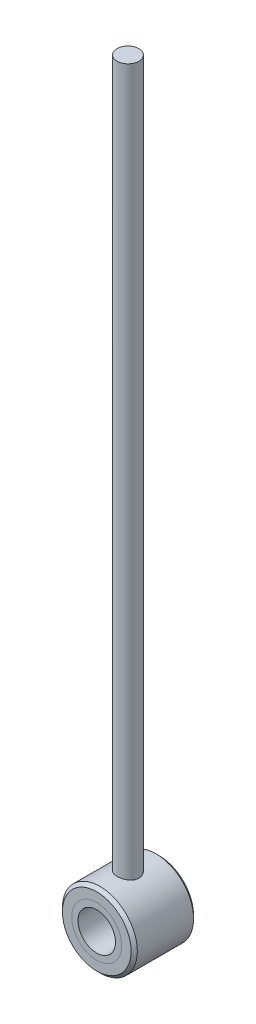
ISO-10303-21;
HEADER;
FILE_DESCRIPTION(('STEP AP214'),'2;1');
FILE_NAME('part.step','',(''),(''),'','','');
FILE_SCHEMA(('AUTOMOTIVE_DESIGN { 1 0 10303 214 1 1 1 1 }'));
ENDSEC;
DATA;
#1=APPLICATION_CONTEXT('core data for automotive mechanical design processes');
#2=APPLICATION_PROTOCOL_DEFINITION('international standard','automotive_design',2000,#1);
#3=PRODUCT_CONTEXT('',#1,'mechanical');
#4=PRODUCT('Part','Part','',(#3));
#5=PRODUCT_RELATED_PRODUCT_CATEGORY('part','',(#4));
#6=PRODUCT_DEFINITION_FORMATION('','',#4);
#7=PRODUCT_DEFINITION_CONTEXT('part definition',#1,'design');
#8=PRODUCT_DEFINITION('design','',#6,#7);
#9=PRODUCT_DEFINITION_SHAPE('','',#8);
#10=(LENGTH_UNIT() NAMED_UNIT(*) SI_UNIT(.MILLI.,.METRE.));
#11=(NAMED_UNIT(*) PLANE_ANGLE_UNIT() SI_UNIT($,.RADIAN.));
#12=(NAMED_UNIT(*) SI_UNIT($,.STERADIAN.) SOLID_ANGLE_UNIT());
#13=UNCERTAINTY_MEASURE_WITH_UNIT(LENGTH_MEASURE(1.E-05),#10,'distance_accuracy_value','');
#14=(GEOMETRIC_REPRESENTATION_CONTEXT(3) GLOBAL_UNCERTAINTY_ASSIGNED_CONTEXT((#13)) GLOBAL_UNIT_ASSIGNED_CONTEXT((#10,
#11,#12)) REPRESENTATION_CONTEXT('',''));
#15=CARTESIAN_POINT('',(0.,0.,0.));
#16=DIRECTION('',(0.,0.,1.));
#17=DIRECTION('',(1.,0.,0.));
#18=AXIS2_PLACEMENT_3D('',#15,#16,#17);
#19=CARTESIAN_POINT('',(0.,-63.,5.));
#20=DIRECTION('',(0.,0.,1.));
#21=DIRECTION('',(1.,0.,0.));
#22=AXIS2_PLACEMENT_3D('',#19,#20,#21);
#23=PLANE('',#22);
#24=CARTESIAN_POINT('',(0.,-63.,5.));
#25=DIRECTION('',(0.,0.,1.));
#26=DIRECTION('',(1.,0.,0.));
#27=AXIS2_PLACEMENT_3D('',#24,#25,#26);
#28=CIRCLE('',#27,5.5);
#29=CARTESIAN_POINT('',(5.5,-63.,5.));
#30=VERTEX_POINT('',#29);
#31=EDGE_CURVE('E85',#30,#30,#28,.T.);
#32=ORIENTED_EDGE('',*,*,#31,.T.);
#33=EDGE_LOOP('',(#32));
#34=FACE_BOUND('',#33,.T.);
#35=CARTESIAN_POINT('',(0.,-63.,5.));
#36=DIRECTION('',(0.,0.,1.));
#37=DIRECTION('',(1.,0.,0.));
#38=AXIS2_PLACEMENT_3D('',#35,#36,#37);
#39=CIRCLE('',#38,4.);
#40=CARTESIAN_POINT('',(4.,-63.,5.));
#41=VERTEX_POINT('',#40);
#42=EDGE_CURVE('E89',#41,#41,#39,.T.);
#43=ORIENTED_EDGE('',*,*,#42,.F.);
#44=EDGE_LOOP('',(#43));
#45=FACE_BOUND('',#44,.T.);
#46=ADVANCED_FACE('F55',(#34,#45),#23,.T.);
#47=CARTESIAN_POINT('',(0.,-63.,-5.));
#48=DIRECTION('',(0.,0.,1.));
#49=DIRECTION('',(1.,0.,0.));
#50=AXIS2_PLACEMENT_3D('',#47,#48,#49);
#51=PLANE('',#50);
#52=CARTESIAN_POINT('',(0.,-63.,-5.));
#53=DIRECTION('',(0.,0.,1.));
#54=DIRECTION('',(1.,0.,0.));
#55=AXIS2_PLACEMENT_3D('',#52,#53,#54);
#56=CIRCLE('',#55,5.5);
#57=CARTESIAN_POINT('',(5.5,-63.,-5.));
#58=VERTEX_POINT('',#57);
#59=EDGE_CURVE('E72',#58,#58,#56,.F.);
#60=ORIENTED_EDGE('',*,*,#59,.T.);
#61=EDGE_LOOP('',(#60));
#62=FACE_BOUND('',#61,.T.);
#63=CARTESIAN_POINT('',(0.,-63.,-5.));
#64=DIRECTION('',(0.,0.,1.));
#65=DIRECTION('',(1.,0.,0.));
#66=AXIS2_PLACEMENT_3D('',#63,#64,#65);
#67=CIRCLE('',#66,4.);
#68=CARTESIAN_POINT('',(4.,-63.,-5.));
#69=VERTEX_POINT('',#68);
#70=EDGE_CURVE('E90',#69,#69,#67,.T.);
#71=ORIENTED_EDGE('',*,*,#70,.T.);
#72=EDGE_LOOP('',(#71));
#73=FACE_BOUND('',#72,.T.);
#74=ADVANCED_FACE('F102',(#62,#73),#51,.F.);
#75=CARTESIAN_POINT('',(0.,-63.,5.));
#76=DIRECTION('',(0.,0.,-1.));
#77=DIRECTION('',(-1.,0.,0.));
#78=AXIS2_PLACEMENT_3D('',#75,#76,#77);
#79=CYLINDRICAL_SURFACE('',#78,6.);
#80=CARTESIAN_POINT('',(0.,-57.,1.75));
#81=CARTESIAN_POINT('',(0.0961253080181352,-57.0000010206722,1.74999851514796));
#82=CARTESIAN_POINT('',(0.192265738977875,-57.0023322744408,1.74205359001831));
#83=CARTESIAN_POINT('',(0.381754666118445,-57.0114047306242,1.71055420393174));
#84=CARTESIAN_POINT('',(0.475102186570465,-57.0181474558412,1.6869943527991));
#85=CARTESIAN_POINT('',(0.656244329270383,-57.0353026213043,1.62511299381745));
#86=CARTESIAN_POINT('',(0.744046672462425,-57.0457098201764,1.58681256248942));
#87=CARTESIAN_POINT('',(0.911982923632397,-57.0691075569196,1.49662155840011));
#88=CARTESIAN_POINT('',(0.992115936834367,-57.0820983956794,1.44472940253345));
#89=CARTESIAN_POINT('',(1.14462561886912,-57.1096697560034,1.32733498418698));
#90=CARTESIAN_POINT('',(1.21676335643119,-57.1242814923017,1.26152966416692));
#91=CARTESIAN_POINT('',(1.34915166645238,-57.1532580108916,1.11882327100677));
#92=CARTESIAN_POINT('',(1.40940036887666,-57.1676227540096,1.0419204556219));
#93=CARTESIAN_POINT('',(1.51753336674037,-57.1948061648788,0.877210332860645));
#94=CARTESIAN_POINT('',(1.56513041604445,-57.2075858824139,0.789207418233691));
#95=CARTESIAN_POINT('',(1.64475391362963,-57.2296876830163,0.606013923598272));
#96=CARTESIAN_POINT('',(1.67678387060038,-57.239010545117,0.510824968855166));
#97=CARTESIAN_POINT('',(1.72351063083406,-57.2528185569123,0.318635370297666));
#98=CARTESIAN_POINT('',(1.73864609017391,-57.2574258647509,0.22175038253513));
#99=CARTESIAN_POINT('',(1.75252346344242,-57.2616449417658,0.0267152085858989));
#100=CARTESIAN_POINT('',(1.75126910635539,-57.2612578472606,-0.0714346847348875));
#101=CARTESIAN_POINT('',(1.73274795276527,-57.2556404031768,-0.262684754591754));
#102=CARTESIAN_POINT('',(1.71602568393069,-57.2505747647953,-0.355843295296757));
#103=CARTESIAN_POINT('',(1.66792117497863,-57.2364367580415,-0.537970810960754));
#104=CARTESIAN_POINT('',(1.63653755962284,-57.2273640138061,-0.626939392038423));
#105=CARTESIAN_POINT('',(1.55958925270797,-57.2060991907803,-0.79951599198089));
#106=CARTESIAN_POINT('',(1.51384428393234,-57.1938678292236,-0.883038582414004));
#107=CARTESIAN_POINT('',(1.40959719774949,-57.1676833952019,-1.04140676759669));
#108=CARTESIAN_POINT('',(1.35109213587038,-57.1537299256728,-1.1162503534955));
#109=CARTESIAN_POINT('',(1.22026040657199,-57.1250008586183,-1.25823060303037));
#110=CARTESIAN_POINT('',(1.14748039837389,-57.1102145177547,-1.32494803431522));
#111=CARTESIAN_POINT('',(0.9915813088856,-57.0819738724518,-1.44532542015724));
#112=CARTESIAN_POINT('',(0.908461646345306,-57.0685196429744,-1.4989846401372));
#113=CARTESIAN_POINT('',(0.733510271908772,-57.044347465768,-1.59195834434727));
#114=CARTESIAN_POINT('',(0.641629012196374,-57.0336465207361,-1.63118430781131));
#115=CARTESIAN_POINT('',(0.452189927913562,-57.0163091221927,-1.69350517085119));
#116=CARTESIAN_POINT('',(0.354633604003035,-57.0096715994901,-1.71660431403327));
#117=CARTESIAN_POINT('',(0.16018119802838,-57.0013761123315,-1.74532827043102));
#118=CARTESIAN_POINT('',(0.0633758944645889,-56.9995561739913,-1.75152170897982));
#119=CARTESIAN_POINT('',(-0.129894955210872,-57.0006281934497,-1.74784612181028));
#120=CARTESIAN_POINT('',(-0.226360542441064,-57.0035195598794,-1.73797911202052));
#121=CARTESIAN_POINT('',(-0.414097830664112,-57.0135835993534,-1.70292441317563));
#122=CARTESIAN_POINT('',(-0.505436223327996,-57.020664460202,-1.67806506010207));
#123=CARTESIAN_POINT('',(-0.6826291039212,-57.0382928390496,-1.61412278066896));
#124=CARTESIAN_POINT('',(-0.768482945307057,-57.0488407648643,-1.57503818099752));
#125=CARTESIAN_POINT('',(-0.934392573124851,-57.0725979306243,-1.48277466207703));
#126=CARTESIAN_POINT('',(-1.01427661269997,-57.0858612169437,-1.42930118905063));
#127=CARTESIAN_POINT('',(-1.16413296084878,-57.1135230476201,-1.31013885078483));
#128=CARTESIAN_POINT('',(-1.23410291257553,-57.1279218606603,-1.24444708948283));
#129=CARTESIAN_POINT('',(-1.36462158583737,-57.1568471756566,-1.10004464961031));
#130=CARTESIAN_POINT('',(-1.42476642228299,-57.1713612128366,-1.02096565619178));
#131=CARTESIAN_POINT('',(-1.5309555158763,-57.198346106997,-0.85352302726517));
#132=CARTESIAN_POINT('',(-1.57700021873977,-57.2108170285561,-0.765159685360933));
#133=CARTESIAN_POINT('',(-1.65335355571835,-57.2321585088909,-0.581990931659042));
#134=CARTESIAN_POINT('',(-1.68374186549711,-57.2410472460457,-0.487220970840185));
#135=CARTESIAN_POINT('',(-1.72804822085091,-57.2541846815424,-0.293604496867779));
#136=CARTESIAN_POINT('',(-1.74197152209896,-57.2584348604906,-0.194759294973107));
#137=CARTESIAN_POINT('',(-1.75260895170656,-57.261673694557,2.25411818007693E-05));
#138=CARTESIAN_POINT('',(-1.74997891215048,-57.2608628738643,0.0959205098643403));
#139=CARTESIAN_POINT('',(-1.72913831847244,-57.2545499180279,0.285842892854041));
#140=CARTESIAN_POINT('',(-1.7109283259395,-57.2490479519794,0.379867374567192));
#141=CARTESIAN_POINT('',(-1.65985748033916,-57.234103375563,0.562366183013164));
#142=CARTESIAN_POINT('',(-1.62716125079618,-57.2247051182146,0.650890475405202));
#143=CARTESIAN_POINT('',(-1.54817363617336,-57.2030328574499,0.821267246121851));
#144=CARTESIAN_POINT('',(-1.50187976224371,-57.1907583276573,0.903118499537303));
#145=CARTESIAN_POINT('',(-1.39513128146528,-57.1641856425823,1.06089207023766));
#146=CARTESIAN_POINT('',(-1.33424162455883,-57.1498321098095,1.13651071754182));
#147=CARTESIAN_POINT('',(-1.20082452655383,-57.120997433353,1.27666967580499));
#148=CARTESIAN_POINT('',(-1.12829412203371,-57.1065162580647,1.34120715711446));
#149=CARTESIAN_POINT('',(-0.971285174602811,-57.0785876007691,1.45910953147708));
#150=CARTESIAN_POINT('',(-0.886536063614254,-57.0651787761761,1.51212417615002));
#151=CARTESIAN_POINT('',(-0.708936452074232,-57.0413579990442,1.60307524955485));
#152=CARTESIAN_POINT('',(-0.616090149336061,-57.0309445055358,1.64101943523146));
#153=CARTESIAN_POINT('',(-0.436605177870393,-57.0153127159519,1.69694094930792));
#154=CARTESIAN_POINT('',(-0.35058619705069,-57.0096163941136,1.71678627055829));
#155=CARTESIAN_POINT('',(-0.176382174555847,-57.0019598422442,1.74331551061332));
#156=CARTESIAN_POINT('',(-0.0881974529296944,-56.9999990635069,1.7500013623901));
#157=CARTESIAN_POINT('',(0.,-57.,1.75));
#158=B_SPLINE_CURVE_WITH_KNOTS('',3,(#80,#81,#82,#83,#84,#85,#86,#87,#88,#89,#90,#91,#92,#93,
#94,#95,#96,#97,#98,#99,#100,#101,#102,#103,#104,#105,#106,#107,#108,#109,#110,#111,#112,#113,
#114,#115,#116,#117,#118,#119,#120,#121,#122,#123,#124,#125,#126,#127,#128,#129,#130,#131,#132,
#133,#134,#135,#136,#137,#138,#139,#140,#141,#142,#143,#144,#145,#146,#147,#148,#149,#150,#151,
#152,#153,#154,#155,#156,#157),.UNSPECIFIED.,.T.,.F.,(4,2,2,2,2,2,2,2,2,2,2,2,2,2,2,2,2,2,2,2,2,
2,2,2,2,2,2,2,2,2,2,2,2,2,2,2,2,2,4),(0.,0.288052093618848,0.576203672859808,0.863944765925737,
1.15171938874705,1.4465642107671,1.74145537223886,2.04255951405361,2.34359575805743,
2.63661948180926,2.92957653844227,3.21259753810652,3.49564509054993,3.78239825352144,
4.06921765673404,4.36732499534254,4.6654490998204,4.96537230276013,5.26521655422946,
5.55484346037066,5.84443401496554,6.12790175562713,6.41140285130437,6.70121883369904,
6.99110359801335,7.29089914342066,7.59068521108749,7.88893020644378,8.18707997551211,
8.47349366019241,8.75989702134953,9.04312596000906,9.32640677192025,9.61950228446207,
9.9126725299444,10.2137891731667,10.5147506265854,10.779084693066,11.0433799290662),.UNSPECIFIED.);
#159=CARTESIAN_POINT('',(0.,-57.,1.75));
#160=VERTEX_POINT('',#159);
#161=EDGE_CURVE('E59',#160,#160,#158,.T.);
#162=ORIENTED_EDGE('',*,*,#161,.F.);
#163=EDGE_LOOP('',(#162));
#164=FACE_BOUND('',#163,.T.);
#165=CARTESIAN_POINT('',(0.,-63.,4.5));
#166=DIRECTION('',(0.,0.,1.));
#167=DIRECTION('',(1.,0.,0.));
#168=AXIS2_PLACEMENT_3D('',#165,#166,#167);
#169=CIRCLE('',#168,6.);
#170=CARTESIAN_POINT('',(6.,-63.,4.5));
#171=VERTEX_POINT('',#170);
#172=EDGE_CURVE('E77',#171,#171,#169,.F.);
#173=ORIENTED_EDGE('',*,*,#172,.T.);
#174=EDGE_LOOP('',(#173));
#175=FACE_BOUND('',#174,.T.);
#176=CARTESIAN_POINT('',(0.,-63.,-4.5));
#177=DIRECTION('',(0.,0.,1.));
#178=DIRECTION('',(1.,0.,0.));
#179=AXIS2_PLACEMENT_3D('',#176,#177,#178);
#180=CIRCLE('',#179,6.);
#181=CARTESIAN_POINT('',(6.,-63.,-4.5));
#182=VERTEX_POINT('',#181);
#183=EDGE_CURVE('E81',#182,#182,#180,.T.);
#184=ORIENTED_EDGE('',*,*,#183,.T.);
#185=EDGE_LOOP('',(#184));
#186=FACE_BOUND('',#185,.T.);
#187=ADVANCED_FACE('F108',(#164,#175,#186),#79,.T.);
#188=CARTESIAN_POINT('',(0.,-63.,5.));
#189=DIRECTION('',(0.,0.,-1.));
#190=DIRECTION('',(-1.,0.,0.));
#191=AXIS2_PLACEMENT_3D('',#188,#189,#190);
#192=CYLINDRICAL_SURFACE('',#191,4.);
#193=ORIENTED_EDGE('',*,*,#42,.T.);
#194=EDGE_LOOP('',(#193));
#195=FACE_BOUND('',#194,.T.);
#196=ORIENTED_EDGE('',*,*,#70,.F.);
#197=EDGE_LOOP('',(#196));
#198=FACE_BOUND('',#197,.T.);
#199=ADVANCED_FACE('F98',(#195,#198),#192,.F.);
#200=CARTESIAN_POINT('',(0.,-63.,5.));
#201=DIRECTION('',(0.,0.,-1.));
#202=DIRECTION('',(-1.,0.,0.));
#203=AXIS2_PLACEMENT_3D('',#200,#201,#202);
#204=CONICAL_SURFACE('',#203,5.5,0.785398163397447);
#205=ORIENTED_EDGE('',*,*,#172,.F.);
#206=EDGE_LOOP('',(#205));
#207=FACE_BOUND('',#206,.T.);
#208=ORIENTED_EDGE('',*,*,#31,.F.);
#209=EDGE_LOOP('',(#208));
#210=FACE_BOUND('',#209,.T.);
#211=ADVANCED_FACE('F117',(#207,#210),#204,.T.);
#212=CARTESIAN_POINT('',(0.,-63.,-4.5));
#213=DIRECTION('',(0.,0.,1.));
#214=DIRECTION('',(1.,0.,0.));
#215=AXIS2_PLACEMENT_3D('',#212,#213,#214);
#216=CONICAL_SURFACE('',#215,6.,0.785398163397452);
#217=ORIENTED_EDGE('',*,*,#59,.F.);
#218=EDGE_LOOP('',(#217));
#219=FACE_BOUND('',#218,.T.);
#220=ORIENTED_EDGE('',*,*,#183,.F.);
#221=EDGE_LOOP('',(#220));
#222=FACE_BOUND('',#221,.T.);
#223=ADVANCED_FACE('F123',(#219,#222),#216,.T.);
#224=CARTESIAN_POINT('',(0.,-69.001,0.));
#225=DIRECTION('',(0.,1.,0.));
#226=DIRECTION('',(0.,0.,1.));
#227=AXIS2_PLACEMENT_3D('',#224,#225,#226);
#228=CYLINDRICAL_SURFACE('',#227,1.75);
#229=CARTESIAN_POINT('',(0.,56.,0.));
#230=DIRECTION('',(0.,1.,0.));
#231=DIRECTION('',(0.,0.,1.));
#232=AXIS2_PLACEMENT_3D('',#229,#230,#231);
#233=CIRCLE('',#232,1.75);
#234=CARTESIAN_POINT('',(0.,56.,1.75));
#235=VERTEX_POINT('',#234);
#236=EDGE_CURVE('E11',#235,#235,#233,.T.);
#237=ORIENTED_EDGE('',*,*,#236,.F.);
#238=EDGE_LOOP('',(#237));
#239=FACE_BOUND('',#238,.T.);
#240=ORIENTED_EDGE('',*,*,#161,.T.);
#241=EDGE_LOOP('',(#240));
#242=FACE_BOUND('',#241,.T.);
#243=ADVANCED_FACE('F128',(#239,#242),#228,.T.);
#244=CARTESIAN_POINT('',(0.,56.,0.));
#245=DIRECTION('',(0.,1.,0.));
#246=DIRECTION('',(0.,0.,1.));
#247=AXIS2_PLACEMENT_3D('',#244,#245,#246);
#248=PLANE('',#247);
#249=ORIENTED_EDGE('',*,*,#236,.T.);
#250=EDGE_LOOP('',(#249));
#251=FACE_BOUND('',#250,.T.);
#252=ADVANCED_FACE('F57',(#251),#248,.T.);
#253=CLOSED_SHELL('',(#46,#74,#187,#199,#211,#223,#243,#252));
#254=MANIFOLD_SOLID_BREP('B2',#253);
#255=CARTESIAN_POINT('',(0.,-63.,5.));
#256=DIRECTION('',(0.,0.,1.));
#257=DIRECTION('',(1.,0.,0.));
#258=AXIS2_PLACEMENT_3D('',#255,#256,#257);
#259=PLANE('',#258);
#260=CARTESIAN_POINT('',(0.,-63.,5.));
#261=DIRECTION('',(0.,0.,1.));
#262=DIRECTION('',(1.,0.,0.));
#263=AXIS2_PLACEMENT_3D('',#260,#261,#262);
#264=CIRCLE('',#263,4.);
#265=CARTESIAN_POINT('',(4.,-63.,5.));
#266=VERTEX_POINT('',#265);
#267=EDGE_CURVE('E54',#266,#266,#264,.T.);
#268=ORIENTED_EDGE('',*,*,#267,.T.);
#269=EDGE_LOOP('',(#268));
#270=FACE_BOUND('',#269,.T.);
#271=CARTESIAN_POINT('',(0.,-63.,5.));
#272=DIRECTION('',(0.,0.,1.));
#273=DIRECTION('',(1.,0.,0.));
#274=AXIS2_PLACEMENT_3D('',#271,#272,#273);
#275=CIRCLE('',#274,3.);
#276=CARTESIAN_POINT('',(3.,-63.,5.));
#277=VERTEX_POINT('',#276);
#278=EDGE_CURVE('E230',#277,#277,#275,.T.);
#279=ORIENTED_EDGE('',*,*,#278,.F.);
#280=EDGE_LOOP('',(#279));
#281=FACE_BOUND('',#280,.T.);
#282=ADVANCED_FACE('F219',(#270,#281),#259,.T.);
#283=CARTESIAN_POINT('',(0.,-63.,-5.));
#284=DIRECTION('',(0.,0.,1.));
#285=DIRECTION('',(1.,0.,0.));
#286=AXIS2_PLACEMENT_3D('',#283,#284,#285);
#287=PLANE('',#286);
#288=CARTESIAN_POINT('',(0.,-63.,-5.));
#289=DIRECTION('',(0.,0.,1.));
#290=DIRECTION('',(1.,0.,0.));
#291=AXIS2_PLACEMENT_3D('',#288,#289,#290);
#292=CIRCLE('',#291,4.);
#293=CARTESIAN_POINT('',(4.,-63.,-5.));
#294=VERTEX_POINT('',#293);
#295=EDGE_CURVE('E223',#294,#294,#292,.T.);
#296=ORIENTED_EDGE('',*,*,#295,.F.);
#297=EDGE_LOOP('',(#296));
#298=FACE_BOUND('',#297,.T.);
#299=CARTESIAN_POINT('',(0.,-63.,-5.));
#300=DIRECTION('',(0.,0.,1.));
#301=DIRECTION('',(1.,0.,0.));
#302=AXIS2_PLACEMENT_3D('',#299,#300,#301);
#303=CIRCLE('',#302,3.);
#304=CARTESIAN_POINT('',(3.,-63.,-5.));
#305=VERTEX_POINT('',#304);
#306=EDGE_CURVE('E232',#305,#305,#303,.T.);
#307=ORIENTED_EDGE('',*,*,#306,.T.);
#308=EDGE_LOOP('',(#307));
#309=FACE_BOUND('',#308,.T.);
#310=ADVANCED_FACE('F242',(#298,#309),#287,.F.);
#311=CARTESIAN_POINT('',(0.,-63.,5.));
#312=DIRECTION('',(0.,0.,-1.));
#313=DIRECTION('',(-1.,0.,0.));
#314=AXIS2_PLACEMENT_3D('',#311,#312,#313);
#315=CYLINDRICAL_SURFACE('',#314,4.);
#316=ORIENTED_EDGE('',*,*,#267,.F.);
#317=EDGE_LOOP('',(#316));
#318=FACE_BOUND('',#317,.T.);
#319=ORIENTED_EDGE('',*,*,#295,.T.);
#320=EDGE_LOOP('',(#319));
#321=FACE_BOUND('',#320,.T.);
#322=ADVANCED_FACE('F221',(#318,#321),#315,.T.);
#323=CARTESIAN_POINT('',(0.,-63.,5.));
#324=DIRECTION('',(0.,0.,-1.));
#325=DIRECTION('',(-1.,0.,0.));
#326=AXIS2_PLACEMENT_3D('',#323,#324,#325);
#327=CYLINDRICAL_SURFACE('',#326,3.);
#328=ORIENTED_EDGE('',*,*,#278,.T.);
#329=EDGE_LOOP('',(#328));
#330=FACE_BOUND('',#329,.T.);
#331=ORIENTED_EDGE('',*,*,#306,.F.);
#332=EDGE_LOOP('',(#331));
#333=FACE_BOUND('',#332,.T.);
#334=ADVANCED_FACE('F238',(#330,#333),#327,.F.);
#335=CLOSED_SHELL('',(#282,#310,#322,#334));
#336=MANIFOLD_SOLID_BREP('B6',#335);
#337=ADVANCED_BREP_SHAPE_REPRESENTATION('',(#18,#254,#336),#14);
#338=SHAPE_DEFINITION_REPRESENTATION(#9,#337);
ENDSEC;
END-ISO-10303-21;
